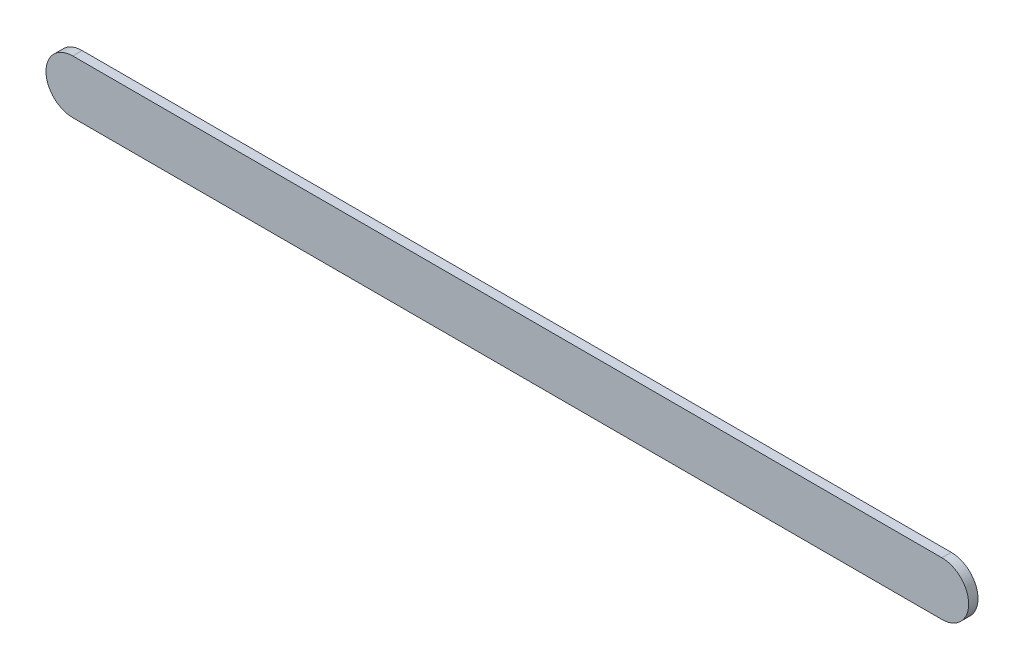
ISO-10303-21;
HEADER;
FILE_DESCRIPTION(('STEP AP214'),'2;1');
FILE_NAME('part.step','',(''),(''),'','','');
FILE_SCHEMA(('AUTOMOTIVE_DESIGN { 1 0 10303 214 1 1 1 1 }'));
ENDSEC;
DATA;
#1=APPLICATION_CONTEXT('core data for automotive mechanical design processes');
#2=APPLICATION_PROTOCOL_DEFINITION('international standard','automotive_design',2000,#1);
#3=PRODUCT_CONTEXT('',#1,'mechanical');
#4=PRODUCT('Part','Part','',(#3));
#5=PRODUCT_RELATED_PRODUCT_CATEGORY('part','',(#4));
#6=PRODUCT_DEFINITION_FORMATION('','',#4);
#7=PRODUCT_DEFINITION_CONTEXT('part definition',#1,'design');
#8=PRODUCT_DEFINITION('design','',#6,#7);
#9=PRODUCT_DEFINITION_SHAPE('','',#8);
#10=(LENGTH_UNIT() NAMED_UNIT(*) SI_UNIT(.MILLI.,.METRE.));
#11=(NAMED_UNIT(*) PLANE_ANGLE_UNIT() SI_UNIT($,.RADIAN.));
#12=(NAMED_UNIT(*) SI_UNIT($,.STERADIAN.) SOLID_ANGLE_UNIT());
#13=UNCERTAINTY_MEASURE_WITH_UNIT(LENGTH_MEASURE(1.E-05),#10,'distance_accuracy_value','');
#14=(GEOMETRIC_REPRESENTATION_CONTEXT(3) GLOBAL_UNCERTAINTY_ASSIGNED_CONTEXT((#13)) GLOBAL_UNIT_ASSIGNED_CONTEXT((#10,
#11,#12)) REPRESENTATION_CONTEXT('',''));
#15=CARTESIAN_POINT('',(0.,0.,0.));
#16=DIRECTION('',(0.,0.,1.));
#17=DIRECTION('',(1.,0.,0.));
#18=AXIS2_PLACEMENT_3D('',#15,#16,#17);
#19=CARTESIAN_POINT('',(76.835,-126.01,1.635));
#20=DIRECTION('',(0.,0.,1.));
#21=DIRECTION('',(1.,0.,0.));
#22=AXIS2_PLACEMENT_3D('',#19,#20,#21);
#23=PLANE('',#22);
#24=DIRECTION('',(1.,0.,0.));
#25=VECTOR('',#24,1.);
#26=CARTESIAN_POINT('',(76.835,-126.01,1.635));
#27=LINE('',#26,#25);
#28=CARTESIAN_POINT('',(76.835,-126.01,1.635));
#29=VERTEX_POINT('',#28);
#30=CARTESIAN_POINT('',(80.085,-126.01,1.635));
#31=VERTEX_POINT('',#30);
#32=EDGE_CURVE('E83',#29,#31,#27,.T.);
#33=ORIENTED_EDGE('',*,*,#32,.T.);
#34=CARTESIAN_POINT('',(80.085,-125.91,1.635));
#35=DIRECTION('',(0.,0.,1.));
#36=DIRECTION('',(0.,-1.,0.));
#37=AXIS2_PLACEMENT_3D('',#34,#35,#36);
#38=CIRCLE('',#37,0.1);
#39=CARTESIAN_POINT('',(80.085,-125.81,1.635));
#40=VERTEX_POINT('',#39);
#41=EDGE_CURVE('E102',#31,#40,#38,.T.);
#42=ORIENTED_EDGE('',*,*,#41,.T.);
#43=DIRECTION('',(-1.,0.,0.));
#44=VECTOR('',#43,1.);
#45=CARTESIAN_POINT('',(80.085,-125.81,1.635));
#46=LINE('',#45,#44);
#47=CARTESIAN_POINT('',(76.835,-125.81,1.635));
#48=VERTEX_POINT('',#47);
#49=EDGE_CURVE('E75',#40,#48,#46,.T.);
#50=ORIENTED_EDGE('',*,*,#49,.T.);
#51=CARTESIAN_POINT('',(76.835,-125.91,1.635));
#52=DIRECTION('',(0.,0.,1.));
#53=DIRECTION('',(-1.42108547152E-13,1.,0.));
#54=AXIS2_PLACEMENT_3D('',#51,#52,#53);
#55=CIRCLE('',#54,0.1);
#56=EDGE_CURVE('E11',#48,#29,#55,.T.);
#57=ORIENTED_EDGE('',*,*,#56,.T.);
#58=EDGE_LOOP('',(#33,#42,#50,#57));
#59=FACE_BOUND('',#58,.T.);
#60=ADVANCED_FACE('F17',(#59),#23,.T.);
#61=CARTESIAN_POINT('',(76.835,-126.01,1.6));
#62=DIRECTION('',(0.,0.,1.));
#63=DIRECTION('',(1.,0.,0.));
#64=AXIS2_PLACEMENT_3D('',#61,#62,#63);
#65=PLANE('',#64);
#66=CARTESIAN_POINT('',(76.835,-125.91,1.6));
#67=DIRECTION('',(0.,0.,1.));
#68=DIRECTION('',(-1.42108547152E-13,1.,0.));
#69=AXIS2_PLACEMENT_3D('',#66,#67,#68);
#70=CIRCLE('',#69,0.1);
#71=CARTESIAN_POINT('',(76.835,-125.81,1.6));
#72=VERTEX_POINT('',#71);
#73=CARTESIAN_POINT('',(76.835,-126.01,1.6));
#74=VERTEX_POINT('',#73);
#75=EDGE_CURVE('E26',#72,#74,#70,.T.);
#76=ORIENTED_EDGE('',*,*,#75,.F.);
#77=DIRECTION('',(-1.,0.,0.));
#78=VECTOR('',#77,1.);
#79=CARTESIAN_POINT('',(80.085,-125.81,1.6));
#80=LINE('',#79,#78);
#81=CARTESIAN_POINT('',(80.085,-125.81,1.6));
#82=VERTEX_POINT('',#81);
#83=EDGE_CURVE('E110',#82,#72,#80,.T.);
#84=ORIENTED_EDGE('',*,*,#83,.F.);
#85=CARTESIAN_POINT('',(80.085,-125.91,1.6));
#86=DIRECTION('',(0.,0.,1.));
#87=DIRECTION('',(0.,-1.,0.));
#88=AXIS2_PLACEMENT_3D('',#85,#86,#87);
#89=CIRCLE('',#88,0.1);
#90=CARTESIAN_POINT('',(80.085,-126.01,1.6));
#91=VERTEX_POINT('',#90);
#92=EDGE_CURVE('E85',#91,#82,#89,.T.);
#93=ORIENTED_EDGE('',*,*,#92,.F.);
#94=DIRECTION('',(1.,0.,0.));
#95=VECTOR('',#94,1.);
#96=CARTESIAN_POINT('',(76.835,-126.01,1.6));
#97=LINE('',#96,#95);
#98=EDGE_CURVE('E81',#74,#91,#97,.T.);
#99=ORIENTED_EDGE('',*,*,#98,.F.);
#100=EDGE_LOOP('',(#76,#84,#93,#99));
#101=FACE_BOUND('',#100,.T.);
#102=ADVANCED_FACE('F19',(#101),#65,.F.);
#103=CARTESIAN_POINT('',(76.835,-125.91,1.6));
#104=DIRECTION('',(0.,0.,-1.));
#105=DIRECTION('',(-1.42108547152E-13,1.,0.));
#106=AXIS2_PLACEMENT_3D('',#103,#104,#105);
#107=CYLINDRICAL_SURFACE('',#106,0.1);
#108=ORIENTED_EDGE('',*,*,#75,.T.);
#109=DIRECTION('',(0.,0.,1.));
#110=VECTOR('',#109,1.);
#111=CARTESIAN_POINT('',(76.835,-126.01,1.6));
#112=LINE('',#111,#110);
#113=EDGE_CURVE('E69',#74,#29,#112,.T.);
#114=ORIENTED_EDGE('',*,*,#113,.T.);
#115=ORIENTED_EDGE('',*,*,#56,.F.);
#116=DIRECTION('',(0.,0.,1.));
#117=VECTOR('',#116,1.);
#118=CARTESIAN_POINT('',(76.835,-125.81,1.6));
#119=LINE('',#118,#117);
#120=EDGE_CURVE('E72',#72,#48,#119,.T.);
#121=ORIENTED_EDGE('',*,*,#120,.F.);
#122=EDGE_LOOP('',(#108,#114,#115,#121));
#123=FACE_BOUND('',#122,.T.);
#124=ADVANCED_FACE('F68',(#123),#107,.T.);
#125=CARTESIAN_POINT('',(80.085,-125.81,1.6));
#126=DIRECTION('',(0.,-1.,0.));
#127=DIRECTION('',(0.,0.,-1.));
#128=AXIS2_PLACEMENT_3D('',#125,#126,#127);
#129=PLANE('',#128);
#130=ORIENTED_EDGE('',*,*,#83,.T.);
#131=ORIENTED_EDGE('',*,*,#120,.T.);
#132=ORIENTED_EDGE('',*,*,#49,.F.);
#133=DIRECTION('',(0.,0.,1.));
#134=VECTOR('',#133,1.);
#135=CARTESIAN_POINT('',(80.085,-125.81,1.6));
#136=LINE('',#135,#134);
#137=EDGE_CURVE('E98',#82,#40,#136,.T.);
#138=ORIENTED_EDGE('',*,*,#137,.F.);
#139=EDGE_LOOP('',(#130,#131,#132,#138));
#140=FACE_BOUND('',#139,.T.);
#141=ADVANCED_FACE('F118',(#140),#129,.F.);
#142=CARTESIAN_POINT('',(80.085,-125.91,1.6));
#143=DIRECTION('',(0.,0.,-1.));
#144=DIRECTION('',(0.,-1.,0.));
#145=AXIS2_PLACEMENT_3D('',#142,#143,#144);
#146=CYLINDRICAL_SURFACE('',#145,0.1);
#147=ORIENTED_EDGE('',*,*,#92,.T.);
#148=ORIENTED_EDGE('',*,*,#137,.T.);
#149=ORIENTED_EDGE('',*,*,#41,.F.);
#150=DIRECTION('',(0.,0.,1.));
#151=VECTOR('',#150,1.);
#152=CARTESIAN_POINT('',(80.085,-126.01,1.6));
#153=LINE('',#152,#151);
#154=EDGE_CURVE('E90',#91,#31,#153,.T.);
#155=ORIENTED_EDGE('',*,*,#154,.F.);
#156=EDGE_LOOP('',(#147,#148,#149,#155));
#157=FACE_BOUND('',#156,.T.);
#158=ADVANCED_FACE('F121',(#157),#146,.T.);
#159=CARTESIAN_POINT('',(76.835,-126.01,1.6));
#160=DIRECTION('',(0.,1.,0.));
#161=DIRECTION('',(1.,0.,0.));
#162=AXIS2_PLACEMENT_3D('',#159,#160,#161);
#163=PLANE('',#162);
#164=ORIENTED_EDGE('',*,*,#98,.T.);
#165=ORIENTED_EDGE('',*,*,#154,.T.);
#166=ORIENTED_EDGE('',*,*,#32,.F.);
#167=ORIENTED_EDGE('',*,*,#113,.F.);
#168=EDGE_LOOP('',(#164,#165,#166,#167));
#169=FACE_BOUND('',#168,.T.);
#170=ADVANCED_FACE('F79',(#169),#163,.F.);
#171=CLOSED_SHELL('',(#60,#102,#124,#141,#158,#170));
#172=MANIFOLD_SOLID_BREP('B1',#171);
#173=ADVANCED_BREP_SHAPE_REPRESENTATION('',(#18,#172),#14);
#174=SHAPE_DEFINITION_REPRESENTATION(#9,#173);
ENDSEC;
END-ISO-10303-21;
